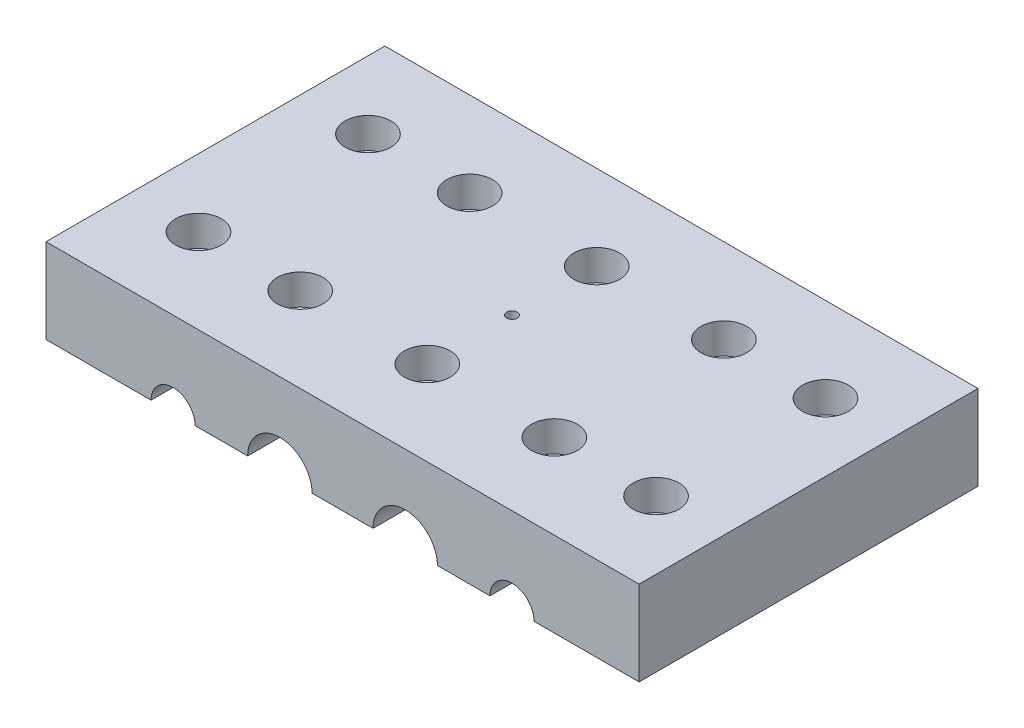
ISO-10303-21;
HEADER;
FILE_DESCRIPTION(('STEP AP214'),'2;1');
FILE_NAME('part.step','',(''),(''),'','','');
FILE_SCHEMA(('AUTOMOTIVE_DESIGN { 1 0 10303 214 1 1 1 1 }'));
ENDSEC;
DATA;
#1=APPLICATION_CONTEXT('core data for automotive mechanical design processes');
#2=APPLICATION_PROTOCOL_DEFINITION('international standard','automotive_design',2000,#1);
#3=PRODUCT_CONTEXT('',#1,'mechanical');
#4=PRODUCT('Part','Part','',(#3));
#5=PRODUCT_RELATED_PRODUCT_CATEGORY('part','',(#4));
#6=PRODUCT_DEFINITION_FORMATION('','',#4);
#7=PRODUCT_DEFINITION_CONTEXT('part definition',#1,'design');
#8=PRODUCT_DEFINITION('design','',#6,#7);
#9=PRODUCT_DEFINITION_SHAPE('','',#8);
#10=(LENGTH_UNIT() NAMED_UNIT(*) SI_UNIT(.MILLI.,.METRE.));
#11=(NAMED_UNIT(*) PLANE_ANGLE_UNIT() SI_UNIT($,.RADIAN.));
#12=(NAMED_UNIT(*) SI_UNIT($,.STERADIAN.) SOLID_ANGLE_UNIT());
#13=UNCERTAINTY_MEASURE_WITH_UNIT(LENGTH_MEASURE(1.E-05),#10,'distance_accuracy_value','');
#14=(GEOMETRIC_REPRESENTATION_CONTEXT(3) GLOBAL_UNCERTAINTY_ASSIGNED_CONTEXT((#13)) GLOBAL_UNIT_ASSIGNED_CONTEXT((#10,
#11,#12)) REPRESENTATION_CONTEXT('',''));
#15=CARTESIAN_POINT('',(0.,0.,0.));
#16=DIRECTION('',(0.,0.,1.));
#17=DIRECTION('',(1.,0.,0.));
#18=AXIS2_PLACEMENT_3D('',#15,#16,#17);
#19=CARTESIAN_POINT('',(0.,0.,0.));
#20=DIRECTION('',(0.,1.,0.));
#21=DIRECTION('',(0.,0.,1.));
#22=AXIS2_PLACEMENT_3D('',#19,#20,#21);
#23=PLANE('',#22);
#24=CARTESIAN_POINT('',(19.05,0.,12.7));
#25=DIRECTION('',(0.,1.,0.));
#26=DIRECTION('',(0.,0.,1.));
#27=AXIS2_PLACEMENT_3D('',#24,#25,#26);
#28=CIRCLE('',#27,2.286);
#29=CARTESIAN_POINT('',(19.05,0.,14.986));
#30=VERTEX_POINT('',#29);
#31=EDGE_CURVE('E334',#30,#30,#28,.T.);
#32=ORIENTED_EDGE('',*,*,#31,.T.);
#33=EDGE_LOOP('',(#32));
#34=FACE_BOUND('',#33,.T.);
#35=CARTESIAN_POINT('',(19.05,0.,-12.7));
#36=DIRECTION('',(0.,1.,0.));
#37=DIRECTION('',(0.,0.,1.));
#38=AXIS2_PLACEMENT_3D('',#35,#36,#37);
#39=CIRCLE('',#38,2.286);
#40=CARTESIAN_POINT('',(19.05,0.,-10.414));
#41=VERTEX_POINT('',#40);
#42=EDGE_CURVE('E241',#41,#41,#39,.T.);
#43=ORIENTED_EDGE('',*,*,#42,.T.);
#44=EDGE_LOOP('',(#43));
#45=FACE_BOUND('',#44,.T.);
#46=DIRECTION('',(-1.,0.,0.));
#47=VECTOR('',#46,1.);
#48=CARTESIAN_POINT('',(-44.45,0.,-25.4));
#49=LINE('',#48,#47);
#50=CARTESIAN_POINT('',(22.098,0.,-25.4));
#51=VERTEX_POINT('',#50);
#52=CARTESIAN_POINT('',(14.224,0.,-25.4));
#53=VERTEX_POINT('',#52);
#54=EDGE_CURVE('E57',#51,#53,#49,.T.);
#55=ORIENTED_EDGE('',*,*,#54,.F.);
#56=DIRECTION('',(0.,0.,1.));
#57=VECTOR('',#56,1.);
#58=CARTESIAN_POINT('',(22.098,0.,-25.4));
#59=LINE('',#58,#57);
#60=CARTESIAN_POINT('',(22.098,0.,25.4));
#61=VERTEX_POINT('',#60);
#62=EDGE_CURVE('E123',#51,#61,#59,.T.);
#63=ORIENTED_EDGE('',*,*,#62,.T.);
#64=DIRECTION('',(1.,0.,0.));
#65=VECTOR('',#64,1.);
#66=CARTESIAN_POINT('',(-44.45,0.,25.4));
#67=LINE('',#66,#65);
#68=CARTESIAN_POINT('',(14.224,0.,25.4));
#69=VERTEX_POINT('',#68);
#70=EDGE_CURVE('E463',#69,#61,#67,.T.);
#71=ORIENTED_EDGE('',*,*,#70,.F.);
#72=DIRECTION('',(0.,0.,1.));
#73=VECTOR('',#72,1.);
#74=CARTESIAN_POINT('',(14.224,0.,-25.4));
#75=LINE('',#74,#73);
#76=EDGE_CURVE('E137',#53,#69,#75,.T.);
#77=ORIENTED_EDGE('',*,*,#76,.F.);
#78=EDGE_LOOP('',(#55,#63,#71,#77));
#79=FACE_BOUND('',#78,.T.);
#80=ADVANCED_FACE('F35',(#34,#45,#79),#23,.F.);
#81=CARTESIAN_POINT('',(0.,0.,12.7));
#82=DIRECTION('',(0.,1.,0.));
#83=DIRECTION('',(0.,0.,1.));
#84=AXIS2_PLACEMENT_3D('',#81,#82,#83);
#85=CIRCLE('',#84,2.286);
#86=CARTESIAN_POINT('',(0.,0.,14.986));
#87=VERTEX_POINT('',#86);
#88=EDGE_CURVE('E328',#87,#87,#85,.T.);
#89=ORIENTED_EDGE('',*,*,#88,.T.);
#90=EDGE_LOOP('',(#89));
#91=FACE_BOUND('',#90,.T.);
#92=CARTESIAN_POINT('',(0.,0.,0.));
#93=DIRECTION('',(0.,1.,0.));
#94=DIRECTION('',(0.,0.,1.));
#95=AXIS2_PLACEMENT_3D('',#92,#93,#94);
#96=CIRCLE('',#95,0.7874);
#97=CARTESIAN_POINT('',(0.,0.,0.7874));
#98=VERTEX_POINT('',#97);
#99=EDGE_CURVE('E306',#98,#98,#96,.T.);
#100=ORIENTED_EDGE('',*,*,#99,.T.);
#101=EDGE_LOOP('',(#100));
#102=FACE_BOUND('',#101,.T.);
#103=CARTESIAN_POINT('',(0.,0.,-12.7));
#104=DIRECTION('',(0.,1.,0.));
#105=DIRECTION('',(0.,0.,1.));
#106=AXIS2_PLACEMENT_3D('',#103,#104,#105);
#107=CIRCLE('',#106,2.286);
#108=CARTESIAN_POINT('',(0.,0.,-10.414));
#109=VERTEX_POINT('',#108);
#110=EDGE_CURVE('E235',#109,#109,#107,.T.);
#111=ORIENTED_EDGE('',*,*,#110,.T.);
#112=EDGE_LOOP('',(#111));
#113=FACE_BOUND('',#112,.T.);
#114=CARTESIAN_POINT('',(4.57200000000001,0.,-25.4));
#115=VERTEX_POINT('',#114);
#116=CARTESIAN_POINT('',(-4.57199999999999,0.,-25.4));
#117=VERTEX_POINT('',#116);
#118=EDGE_CURVE('E138',#115,#117,#49,.T.);
#119=ORIENTED_EDGE('',*,*,#118,.F.);
#120=DIRECTION('',(0.,0.,1.));
#121=VECTOR('',#120,1.);
#122=CARTESIAN_POINT('',(4.57200000000001,0.,-25.4));
#123=LINE('',#122,#121);
#124=CARTESIAN_POINT('',(4.57200000000001,0.,25.4));
#125=VERTEX_POINT('',#124);
#126=EDGE_CURVE('E297',#115,#125,#123,.T.);
#127=ORIENTED_EDGE('',*,*,#126,.T.);
#128=CARTESIAN_POINT('',(-4.57199999999999,0.,25.4));
#129=VERTEX_POINT('',#128);
#130=EDGE_CURVE('E461',#129,#125,#67,.T.);
#131=ORIENTED_EDGE('',*,*,#130,.F.);
#132=DIRECTION('',(0.,0.,1.));
#133=VECTOR('',#132,1.);
#134=CARTESIAN_POINT('',(-4.57199999999999,0.,-25.4));
#135=LINE('',#134,#133);
#136=EDGE_CURVE('E285',#117,#129,#135,.T.);
#137=ORIENTED_EDGE('',*,*,#136,.F.);
#138=EDGE_LOOP('',(#119,#127,#131,#137));
#139=FACE_BOUND('',#138,.T.);
#140=ADVANCED_FACE('F359',(#91,#102,#113,#139),#23,.F.);
#141=CARTESIAN_POINT('',(-19.05,0.,12.7));
#142=DIRECTION('',(0.,1.,0.));
#143=DIRECTION('',(0.,0.,1.));
#144=AXIS2_PLACEMENT_3D('',#141,#142,#143);
#145=CIRCLE('',#144,2.286);
#146=CARTESIAN_POINT('',(-19.05,0.,14.986));
#147=VERTEX_POINT('',#146);
#148=EDGE_CURVE('E322',#147,#147,#145,.T.);
#149=ORIENTED_EDGE('',*,*,#148,.T.);
#150=EDGE_LOOP('',(#149));
#151=FACE_BOUND('',#150,.T.);
#152=CARTESIAN_POINT('',(-19.05,0.,-12.7));
#153=DIRECTION('',(0.,1.,0.));
#154=DIRECTION('',(0.,0.,1.));
#155=AXIS2_PLACEMENT_3D('',#152,#153,#154);
#156=CIRCLE('',#155,2.286);
#157=CARTESIAN_POINT('',(-19.05,0.,-10.414));
#158=VERTEX_POINT('',#157);
#159=EDGE_CURVE('E229',#158,#158,#156,.T.);
#160=ORIENTED_EDGE('',*,*,#159,.T.);
#161=EDGE_LOOP('',(#160));
#162=FACE_BOUND('',#161,.T.);
#163=CARTESIAN_POINT('',(-14.224,0.,-25.4));
#164=VERTEX_POINT('',#163);
#165=CARTESIAN_POINT('',(-22.098,0.,-25.4));
#166=VERTEX_POINT('',#165);
#167=EDGE_CURVE('E142',#164,#166,#49,.T.);
#168=ORIENTED_EDGE('',*,*,#167,.F.);
#169=DIRECTION('',(0.,0.,1.));
#170=VECTOR('',#169,1.);
#171=CARTESIAN_POINT('',(-14.224,0.,-25.4));
#172=LINE('',#171,#170);
#173=CARTESIAN_POINT('',(-14.224,0.,25.4));
#174=VERTEX_POINT('',#173);
#175=EDGE_CURVE('E288',#164,#174,#172,.T.);
#176=ORIENTED_EDGE('',*,*,#175,.T.);
#177=CARTESIAN_POINT('',(-22.098,0.,25.4));
#178=VERTEX_POINT('',#177);
#179=EDGE_CURVE('E153',#178,#174,#67,.T.);
#180=ORIENTED_EDGE('',*,*,#179,.F.);
#181=DIRECTION('',(0.,0.,1.));
#182=VECTOR('',#181,1.);
#183=CARTESIAN_POINT('',(-22.098,0.,-25.4));
#184=LINE('',#183,#182);
#185=EDGE_CURVE('E278',#166,#178,#184,.T.);
#186=ORIENTED_EDGE('',*,*,#185,.F.);
#187=EDGE_LOOP('',(#168,#176,#180,#186));
#188=FACE_BOUND('',#187,.T.);
#189=ADVANCED_FACE('F365',(#151,#162,#188),#23,.F.);
#190=CARTESIAN_POINT('',(-34.29,0.,12.7));
#191=DIRECTION('',(0.,1.,0.));
#192=DIRECTION('',(0.,0.,1.));
#193=AXIS2_PLACEMENT_3D('',#190,#191,#192);
#194=CIRCLE('',#193,2.286);
#195=CARTESIAN_POINT('',(-34.29,0.,14.986));
#196=VERTEX_POINT('',#195);
#197=EDGE_CURVE('E316',#196,#196,#194,.T.);
#198=ORIENTED_EDGE('',*,*,#197,.T.);
#199=EDGE_LOOP('',(#198));
#200=FACE_BOUND('',#199,.T.);
#201=CARTESIAN_POINT('',(-34.29,0.,-12.7));
#202=DIRECTION('',(0.,1.,0.));
#203=DIRECTION('',(0.,0.,1.));
#204=AXIS2_PLACEMENT_3D('',#201,#202,#203);
#205=CIRCLE('',#204,2.286);
#206=CARTESIAN_POINT('',(-34.29,0.,-10.414));
#207=VERTEX_POINT('',#206);
#208=EDGE_CURVE('E223',#207,#207,#205,.T.);
#209=ORIENTED_EDGE('',*,*,#208,.T.);
#210=EDGE_LOOP('',(#209));
#211=FACE_BOUND('',#210,.T.);
#212=CARTESIAN_POINT('',(-28.702,0.,-25.4));
#213=VERTEX_POINT('',#212);
#214=CARTESIAN_POINT('',(-44.45,0.,-25.4));
#215=VERTEX_POINT('',#214);
#216=EDGE_CURVE('E141',#213,#215,#49,.T.);
#217=ORIENTED_EDGE('',*,*,#216,.F.);
#218=DIRECTION('',(0.,0.,1.));
#219=VECTOR('',#218,1.);
#220=CARTESIAN_POINT('',(-28.702,0.,-25.4));
#221=LINE('',#220,#219);
#222=CARTESIAN_POINT('',(-28.702,0.,25.4));
#223=VERTEX_POINT('',#222);
#224=EDGE_CURVE('E173',#213,#223,#221,.T.);
#225=ORIENTED_EDGE('',*,*,#224,.T.);
#226=CARTESIAN_POINT('',(-44.45,0.,25.4));
#227=VERTEX_POINT('',#226);
#228=EDGE_CURVE('E149',#227,#223,#67,.T.);
#229=ORIENTED_EDGE('',*,*,#228,.F.);
#230=DIRECTION('',(0.,0.,1.));
#231=VECTOR('',#230,1.);
#232=CARTESIAN_POINT('',(-44.45,0.,-25.4));
#233=LINE('',#232,#231);
#234=EDGE_CURVE('E140',#215,#227,#233,.T.);
#235=ORIENTED_EDGE('',*,*,#234,.F.);
#236=EDGE_LOOP('',(#217,#225,#229,#235));
#237=FACE_BOUND('',#236,.T.);
#238=ADVANCED_FACE('F171',(#200,#211,#237),#23,.F.);
#239=CARTESIAN_POINT('',(44.45,12.7,-25.4));
#240=DIRECTION('',(-1.,0.,0.));
#241=DIRECTION('',(0.,0.,1.));
#242=AXIS2_PLACEMENT_3D('',#239,#240,#241);
#243=PLANE('',#242);
#244=DIRECTION('',(0.,0.,-1.));
#245=VECTOR('',#244,1.);
#246=CARTESIAN_POINT('',(44.45,0.,-25.4));
#247=LINE('',#246,#245);
#248=CARTESIAN_POINT('',(44.45,0.,25.4));
#249=VERTEX_POINT('',#248);
#250=CARTESIAN_POINT('',(44.45,0.,-25.4));
#251=VERTEX_POINT('',#250);
#252=EDGE_CURVE('E145',#249,#251,#247,.T.);
#253=ORIENTED_EDGE('',*,*,#252,.T.);
#254=DIRECTION('',(0.,-1.,0.));
#255=VECTOR('',#254,1.);
#256=CARTESIAN_POINT('',(44.45,12.7,-25.4));
#257=LINE('',#256,#255);
#258=CARTESIAN_POINT('',(44.45,12.7,-25.4));
#259=VERTEX_POINT('',#258);
#260=EDGE_CURVE('E11',#259,#251,#257,.T.);
#261=ORIENTED_EDGE('',*,*,#260,.F.);
#262=DIRECTION('',(0.,0.,-1.));
#263=VECTOR('',#262,1.);
#264=CARTESIAN_POINT('',(44.45,12.7,-25.4));
#265=LINE('',#264,#263);
#266=CARTESIAN_POINT('',(44.45,12.7,25.4));
#267=VERTEX_POINT('',#266);
#268=EDGE_CURVE('E152',#267,#259,#265,.T.);
#269=ORIENTED_EDGE('',*,*,#268,.F.);
#270=DIRECTION('',(0.,-1.,0.));
#271=VECTOR('',#270,1.);
#272=CARTESIAN_POINT('',(44.45,12.7,25.4));
#273=LINE('',#272,#271);
#274=EDGE_CURVE('E154',#267,#249,#273,.T.);
#275=ORIENTED_EDGE('',*,*,#274,.T.);
#276=EDGE_LOOP('',(#253,#261,#269,#275));
#277=FACE_BOUND('',#276,.T.);
#278=ADVANCED_FACE('F37',(#277),#243,.F.);
#279=CARTESIAN_POINT('',(-44.45,12.7,-25.4));
#280=DIRECTION('',(0.,0.,1.));
#281=DIRECTION('',(1.,0.,0.));
#282=AXIS2_PLACEMENT_3D('',#279,#280,#281);
#283=PLANE('',#282);
#284=CARTESIAN_POINT('',(28.702,0.,-25.4));
#285=VERTEX_POINT('',#284);
#286=EDGE_CURVE('E134',#251,#285,#49,.T.);
#287=ORIENTED_EDGE('',*,*,#286,.T.);
#288=CARTESIAN_POINT('',(25.4,0.,-25.4));
#289=DIRECTION('',(0.,0.,1.));
#290=DIRECTION('',(1.,0.,0.));
#291=AXIS2_PLACEMENT_3D('',#288,#289,#290);
#292=CIRCLE('',#291,3.302);
#293=EDGE_CURVE('E50',#285,#51,#292,.T.);
#294=ORIENTED_EDGE('',*,*,#293,.T.);
#295=ORIENTED_EDGE('',*,*,#54,.T.);
#296=CARTESIAN_POINT('',(9.39800000000001,0.,-25.4));
#297=DIRECTION('',(0.,0.,1.));
#298=DIRECTION('',(1.,0.,0.));
#299=AXIS2_PLACEMENT_3D('',#296,#297,#298);
#300=CIRCLE('',#299,4.826);
#301=EDGE_CURVE('E300',#53,#115,#300,.T.);
#302=ORIENTED_EDGE('',*,*,#301,.T.);
#303=ORIENTED_EDGE('',*,*,#118,.T.);
#304=CARTESIAN_POINT('',(-9.39799999999999,0.,-25.4));
#305=DIRECTION('',(0.,0.,1.));
#306=DIRECTION('',(1.,0.,0.));
#307=AXIS2_PLACEMENT_3D('',#304,#305,#306);
#308=CIRCLE('',#307,4.826);
#309=EDGE_CURVE('E291',#117,#164,#308,.T.);
#310=ORIENTED_EDGE('',*,*,#309,.T.);
#311=ORIENTED_EDGE('',*,*,#167,.T.);
#312=CARTESIAN_POINT('',(-25.4,0.,-25.4));
#313=DIRECTION('',(0.,0.,1.));
#314=DIRECTION('',(1.,0.,0.));
#315=AXIS2_PLACEMENT_3D('',#312,#313,#314);
#316=CIRCLE('',#315,3.302);
#317=EDGE_CURVE('E282',#166,#213,#316,.T.);
#318=ORIENTED_EDGE('',*,*,#317,.T.);
#319=ORIENTED_EDGE('',*,*,#216,.T.);
#320=DIRECTION('',(0.,-1.,0.));
#321=VECTOR('',#320,1.);
#322=CARTESIAN_POINT('',(-44.45,12.7,-25.4));
#323=LINE('',#322,#321);
#324=CARTESIAN_POINT('',(-44.45,12.7,-25.4));
#325=VERTEX_POINT('',#324);
#326=EDGE_CURVE('E43',#325,#215,#323,.T.);
#327=ORIENTED_EDGE('',*,*,#326,.F.);
#328=DIRECTION('',(-1.,0.,0.));
#329=VECTOR('',#328,1.);
#330=CARTESIAN_POINT('',(-44.45,12.7,-25.4));
#331=LINE('',#330,#329);
#332=EDGE_CURVE('E185',#259,#325,#331,.T.);
#333=ORIENTED_EDGE('',*,*,#332,.F.);
#334=ORIENTED_EDGE('',*,*,#260,.T.);
#335=EDGE_LOOP('',(#287,#294,#295,#302,#303,#310,#311,#318,#319,#327,#333,#334));
#336=FACE_BOUND('',#335,.T.);
#337=ADVANCED_FACE('F133',(#336),#283,.F.);
#338=CARTESIAN_POINT('',(-44.45,12.7,-25.4));
#339=DIRECTION('',(1.,0.,0.));
#340=DIRECTION('',(0.,0.,-1.));
#341=AXIS2_PLACEMENT_3D('',#338,#339,#340);
#342=PLANE('',#341);
#343=ORIENTED_EDGE('',*,*,#234,.T.);
#344=DIRECTION('',(0.,-1.,0.));
#345=VECTOR('',#344,1.);
#346=CARTESIAN_POINT('',(-44.45,12.7,25.4));
#347=LINE('',#346,#345);
#348=CARTESIAN_POINT('',(-44.45,12.7,25.4));
#349=VERTEX_POINT('',#348);
#350=EDGE_CURVE('E157',#349,#227,#347,.T.);
#351=ORIENTED_EDGE('',*,*,#350,.F.);
#352=DIRECTION('',(0.,0.,1.));
#353=VECTOR('',#352,1.);
#354=CARTESIAN_POINT('',(-44.45,12.7,-25.4));
#355=LINE('',#354,#353);
#356=EDGE_CURVE('E167',#325,#349,#355,.T.);
#357=ORIENTED_EDGE('',*,*,#356,.F.);
#358=ORIENTED_EDGE('',*,*,#326,.T.);
#359=EDGE_LOOP('',(#343,#351,#357,#358));
#360=FACE_BOUND('',#359,.T.);
#361=ADVANCED_FACE('F165',(#360),#342,.F.);
#362=CARTESIAN_POINT('',(-44.45,12.7,25.4));
#363=DIRECTION('',(0.,0.,-1.));
#364=DIRECTION('',(-1.,0.,0.));
#365=AXIS2_PLACEMENT_3D('',#362,#363,#364);
#366=PLANE('',#365);
#367=ORIENTED_EDGE('',*,*,#70,.T.);
#368=CARTESIAN_POINT('',(25.4,0.,25.4));
#369=DIRECTION('',(0.,0.,1.));
#370=DIRECTION('',(1.,0.,0.));
#371=AXIS2_PLACEMENT_3D('',#368,#369,#370);
#372=CIRCLE('',#371,3.302);
#373=CARTESIAN_POINT('',(28.702,0.,25.4));
#374=VERTEX_POINT('',#373);
#375=EDGE_CURVE('E126',#374,#61,#372,.T.);
#376=ORIENTED_EDGE('',*,*,#375,.F.);
#377=EDGE_CURVE('E148',#374,#249,#67,.T.);
#378=ORIENTED_EDGE('',*,*,#377,.T.);
#379=ORIENTED_EDGE('',*,*,#274,.F.);
#380=DIRECTION('',(1.,0.,0.));
#381=VECTOR('',#380,1.);
#382=CARTESIAN_POINT('',(-44.45,12.7,25.4));
#383=LINE('',#382,#381);
#384=EDGE_CURVE('E158',#349,#267,#383,.T.);
#385=ORIENTED_EDGE('',*,*,#384,.F.);
#386=ORIENTED_EDGE('',*,*,#350,.T.);
#387=ORIENTED_EDGE('',*,*,#228,.T.);
#388=CARTESIAN_POINT('',(-25.4,0.,25.4));
#389=DIRECTION('',(0.,0.,1.));
#390=DIRECTION('',(1.,0.,0.));
#391=AXIS2_PLACEMENT_3D('',#388,#389,#390);
#392=CIRCLE('',#391,3.302);
#393=EDGE_CURVE('E178',#178,#223,#392,.T.);
#394=ORIENTED_EDGE('',*,*,#393,.F.);
#395=ORIENTED_EDGE('',*,*,#179,.T.);
#396=CARTESIAN_POINT('',(-9.39799999999999,0.,25.4));
#397=DIRECTION('',(0.,0.,1.));
#398=DIRECTION('',(1.,0.,0.));
#399=AXIS2_PLACEMENT_3D('',#396,#397,#398);
#400=CIRCLE('',#399,4.826);
#401=EDGE_CURVE('E293',#129,#174,#400,.T.);
#402=ORIENTED_EDGE('',*,*,#401,.F.);
#403=ORIENTED_EDGE('',*,*,#130,.T.);
#404=CARTESIAN_POINT('',(9.39800000000001,0.,25.4));
#405=DIRECTION('',(0.,0.,1.));
#406=DIRECTION('',(1.,0.,0.));
#407=AXIS2_PLACEMENT_3D('',#404,#405,#406);
#408=CIRCLE('',#407,4.826);
#409=EDGE_CURVE('E302',#69,#125,#408,.T.);
#410=ORIENTED_EDGE('',*,*,#409,.F.);
#411=EDGE_LOOP('',(#367,#376,#378,#379,#385,#386,#387,#394,#395,#402,#403,#410));
#412=FACE_BOUND('',#411,.T.);
#413=ADVANCED_FACE('F176',(#412),#366,.F.);
#414=CARTESIAN_POINT('',(0.,12.7,0.));
#415=DIRECTION('',(0.,1.,0.));
#416=DIRECTION('',(0.,0.,1.));
#417=AXIS2_PLACEMENT_3D('',#414,#415,#416);
#418=PLANE('',#417);
#419=CARTESIAN_POINT('',(0.,12.7,0.));
#420=DIRECTION('',(0.,1.,0.));
#421=DIRECTION('',(0.,0.,1.));
#422=AXIS2_PLACEMENT_3D('',#419,#420,#421);
#423=CIRCLE('',#422,0.7874);
#424=CARTESIAN_POINT('',(0.,12.7,0.7874));
#425=VERTEX_POINT('',#424);
#426=EDGE_CURVE('E308',#425,#425,#423,.T.);
#427=ORIENTED_EDGE('',*,*,#426,.F.);
#428=EDGE_LOOP('',(#427));
#429=FACE_BOUND('',#428,.T.);
#430=CARTESIAN_POINT('',(34.29,12.7,12.7));
#431=DIRECTION('',(0.,1.,0.));
#432=DIRECTION('',(0.,0.,1.));
#433=AXIS2_PLACEMENT_3D('',#430,#431,#432);
#434=CIRCLE('',#433,3.429);
#435=CARTESIAN_POINT('',(34.29,12.7,16.129));
#436=VERTEX_POINT('',#435);
#437=EDGE_CURVE('E275',#436,#436,#434,.T.);
#438=ORIENTED_EDGE('',*,*,#437,.F.);
#439=EDGE_LOOP('',(#438));
#440=FACE_BOUND('',#439,.T.);
#441=CARTESIAN_POINT('',(19.05,12.7,12.7));
#442=DIRECTION('',(0.,1.,0.));
#443=DIRECTION('',(0.,0.,1.));
#444=AXIS2_PLACEMENT_3D('',#441,#442,#443);
#445=CIRCLE('',#444,3.429);
#446=CARTESIAN_POINT('',(19.05,12.7,16.129));
#447=VERTEX_POINT('',#446);
#448=EDGE_CURVE('E269',#447,#447,#445,.T.);
#449=ORIENTED_EDGE('',*,*,#448,.F.);
#450=EDGE_LOOP('',(#449));
#451=FACE_BOUND('',#450,.T.);
#452=CARTESIAN_POINT('',(0.,12.7,12.7));
#453=DIRECTION('',(0.,1.,0.));
#454=DIRECTION('',(0.,0.,1.));
#455=AXIS2_PLACEMENT_3D('',#452,#453,#454);
#456=CIRCLE('',#455,3.429);
#457=CARTESIAN_POINT('',(0.,12.7,16.129));
#458=VERTEX_POINT('',#457);
#459=EDGE_CURVE('E263',#458,#458,#456,.T.);
#460=ORIENTED_EDGE('',*,*,#459,.F.);
#461=EDGE_LOOP('',(#460));
#462=FACE_BOUND('',#461,.T.);
#463=CARTESIAN_POINT('',(-19.05,12.7,12.7));
#464=DIRECTION('',(0.,1.,0.));
#465=DIRECTION('',(0.,0.,1.));
#466=AXIS2_PLACEMENT_3D('',#463,#464,#465);
#467=CIRCLE('',#466,3.429);
#468=CARTESIAN_POINT('',(-19.05,12.7,16.129));
#469=VERTEX_POINT('',#468);
#470=EDGE_CURVE('E257',#469,#469,#467,.T.);
#471=ORIENTED_EDGE('',*,*,#470,.F.);
#472=EDGE_LOOP('',(#471));
#473=FACE_BOUND('',#472,.T.);
#474=CARTESIAN_POINT('',(-34.29,12.7,12.7));
#475=DIRECTION('',(0.,1.,0.));
#476=DIRECTION('',(0.,0.,1.));
#477=AXIS2_PLACEMENT_3D('',#474,#475,#476);
#478=CIRCLE('',#477,3.429);
#479=CARTESIAN_POINT('',(-34.29,12.7,16.129));
#480=VERTEX_POINT('',#479);
#481=EDGE_CURVE('E251',#480,#480,#478,.T.);
#482=ORIENTED_EDGE('',*,*,#481,.F.);
#483=EDGE_LOOP('',(#482));
#484=FACE_BOUND('',#483,.T.);
#485=CARTESIAN_POINT('',(34.29,12.7,-12.7));
#486=DIRECTION('',(0.,1.,0.));
#487=DIRECTION('',(0.,0.,1.));
#488=AXIS2_PLACEMENT_3D('',#485,#486,#487);
#489=CIRCLE('',#488,3.429);
#490=CARTESIAN_POINT('',(34.29,12.7,-9.271));
#491=VERTEX_POINT('',#490);
#492=EDGE_CURVE('E215',#491,#491,#489,.T.);
#493=ORIENTED_EDGE('',*,*,#492,.F.);
#494=EDGE_LOOP('',(#493));
#495=FACE_BOUND('',#494,.T.);
#496=CARTESIAN_POINT('',(19.05,12.7,-12.7));
#497=DIRECTION('',(0.,1.,0.));
#498=DIRECTION('',(0.,0.,1.));
#499=AXIS2_PLACEMENT_3D('',#496,#497,#498);
#500=CIRCLE('',#499,3.429);
#501=CARTESIAN_POINT('',(19.05,12.7,-9.271));
#502=VERTEX_POINT('',#501);
#503=EDGE_CURVE('E209',#502,#502,#500,.T.);
#504=ORIENTED_EDGE('',*,*,#503,.F.);
#505=EDGE_LOOP('',(#504));
#506=FACE_BOUND('',#505,.T.);
#507=CARTESIAN_POINT('',(0.,12.7,-12.7));
#508=DIRECTION('',(0.,1.,0.));
#509=DIRECTION('',(0.,0.,1.));
#510=AXIS2_PLACEMENT_3D('',#507,#508,#509);
#511=CIRCLE('',#510,3.429);
#512=CARTESIAN_POINT('',(0.,12.7,-9.271));
#513=VERTEX_POINT('',#512);
#514=EDGE_CURVE('E203',#513,#513,#511,.T.);
#515=ORIENTED_EDGE('',*,*,#514,.F.);
#516=EDGE_LOOP('',(#515));
#517=FACE_BOUND('',#516,.T.);
#518=CARTESIAN_POINT('',(-19.05,12.7,-12.7));
#519=DIRECTION('',(0.,1.,0.));
#520=DIRECTION('',(0.,0.,1.));
#521=AXIS2_PLACEMENT_3D('',#518,#519,#520);
#522=CIRCLE('',#521,3.429);
#523=CARTESIAN_POINT('',(-19.05,12.7,-9.271));
#524=VERTEX_POINT('',#523);
#525=EDGE_CURVE('E197',#524,#524,#522,.T.);
#526=ORIENTED_EDGE('',*,*,#525,.F.);
#527=EDGE_LOOP('',(#526));
#528=FACE_BOUND('',#527,.T.);
#529=CARTESIAN_POINT('',(-34.29,12.7,-12.7));
#530=DIRECTION('',(0.,1.,0.));
#531=DIRECTION('',(0.,0.,1.));
#532=AXIS2_PLACEMENT_3D('',#529,#530,#531);
#533=CIRCLE('',#532,3.429);
#534=CARTESIAN_POINT('',(-34.29,12.7,-9.271));
#535=VERTEX_POINT('',#534);
#536=EDGE_CURVE('E190',#535,#535,#533,.T.);
#537=ORIENTED_EDGE('',*,*,#536,.F.);
#538=EDGE_LOOP('',(#537));
#539=FACE_BOUND('',#538,.T.);
#540=ORIENTED_EDGE('',*,*,#268,.T.);
#541=ORIENTED_EDGE('',*,*,#332,.T.);
#542=ORIENTED_EDGE('',*,*,#356,.T.);
#543=ORIENTED_EDGE('',*,*,#384,.T.);
#544=EDGE_LOOP('',(#540,#541,#542,#543));
#545=FACE_BOUND('',#544,.T.);
#546=ADVANCED_FACE('F372',(#429,#440,#451,#462,#473,#484,#495,#506,#517,#528,#539,#545),#418,.T.);
#547=CARTESIAN_POINT('',(34.29,0.,12.7));
#548=DIRECTION('',(0.,1.,0.));
#549=DIRECTION('',(0.,0.,1.));
#550=AXIS2_PLACEMENT_3D('',#547,#548,#549);
#551=CIRCLE('',#550,2.286);
#552=CARTESIAN_POINT('',(34.29,0.,14.986));
#553=VERTEX_POINT('',#552);
#554=EDGE_CURVE('E340',#553,#553,#551,.T.);
#555=ORIENTED_EDGE('',*,*,#554,.T.);
#556=EDGE_LOOP('',(#555));
#557=FACE_BOUND('',#556,.T.);
#558=CARTESIAN_POINT('',(34.29,0.,-12.7));
#559=DIRECTION('',(0.,1.,0.));
#560=DIRECTION('',(0.,0.,1.));
#561=AXIS2_PLACEMENT_3D('',#558,#559,#560);
#562=CIRCLE('',#561,2.286);
#563=CARTESIAN_POINT('',(34.29,0.,-10.414));
#564=VERTEX_POINT('',#563);
#565=EDGE_CURVE('E247',#564,#564,#562,.T.);
#566=ORIENTED_EDGE('',*,*,#565,.T.);
#567=EDGE_LOOP('',(#566));
#568=FACE_BOUND('',#567,.T.);
#569=ORIENTED_EDGE('',*,*,#377,.F.);
#570=DIRECTION('',(0.,0.,1.));
#571=VECTOR('',#570,1.);
#572=CARTESIAN_POINT('',(28.702,0.,-25.4));
#573=LINE('',#572,#571);
#574=EDGE_CURVE('E130',#285,#374,#573,.T.);
#575=ORIENTED_EDGE('',*,*,#574,.F.);
#576=ORIENTED_EDGE('',*,*,#286,.F.);
#577=ORIENTED_EDGE('',*,*,#252,.F.);
#578=EDGE_LOOP('',(#569,#575,#576,#577));
#579=FACE_BOUND('',#578,.T.);
#580=ADVANCED_FACE('F344',(#557,#568,#579),#23,.F.);
#581=CARTESIAN_POINT('',(-34.29,8.128,-12.7));
#582=DIRECTION('',(0.,1.,0.));
#583=DIRECTION('',(0.,0.,1.));
#584=AXIS2_PLACEMENT_3D('',#581,#582,#583);
#585=CYLINDRICAL_SURFACE('',#584,3.429);
#586=CARTESIAN_POINT('',(-34.29,8.128,-12.7));
#587=DIRECTION('',(0.,1.,0.));
#588=DIRECTION('',(0.,0.,1.));
#589=AXIS2_PLACEMENT_3D('',#586,#587,#588);
#590=CIRCLE('',#589,3.429);
#591=CARTESIAN_POINT('',(-34.29,8.128,-9.271));
#592=VERTEX_POINT('',#591);
#593=EDGE_CURVE('E193',#592,#592,#590,.T.);
#594=ORIENTED_EDGE('',*,*,#593,.F.);
#595=EDGE_LOOP('',(#594));
#596=FACE_BOUND('',#595,.T.);
#597=ORIENTED_EDGE('',*,*,#536,.T.);
#598=EDGE_LOOP('',(#597));
#599=FACE_BOUND('',#598,.T.);
#600=ADVANCED_FACE('F371',(#596,#599),#585,.F.);
#601=CARTESIAN_POINT('',(-34.29,8.128,-12.7));
#602=DIRECTION('',(0.,1.,0.));
#603=DIRECTION('',(0.,0.,1.));
#604=AXIS2_PLACEMENT_3D('',#601,#602,#603);
#605=PLANE('',#604);
#606=CARTESIAN_POINT('',(-34.29,8.128,-12.7));
#607=DIRECTION('',(0.,1.,0.));
#608=DIRECTION('',(0.,0.,1.));
#609=AXIS2_PLACEMENT_3D('',#606,#607,#608);
#610=CIRCLE('',#609,2.286);
#611=CARTESIAN_POINT('',(-34.29,8.128,-10.414));
#612=VERTEX_POINT('',#611);
#613=EDGE_CURVE('E218',#612,#612,#610,.T.);
#614=ORIENTED_EDGE('',*,*,#613,.F.);
#615=EDGE_LOOP('',(#614));
#616=FACE_BOUND('',#615,.T.);
#617=ORIENTED_EDGE('',*,*,#593,.T.);
#618=EDGE_LOOP('',(#617));
#619=FACE_BOUND('',#618,.T.);
#620=ADVANCED_FACE('F377',(#616,#619),#605,.T.);
#621=CARTESIAN_POINT('',(-19.05,8.128,-12.7));
#622=DIRECTION('',(0.,1.,0.));
#623=DIRECTION('',(0.,0.,1.));
#624=AXIS2_PLACEMENT_3D('',#621,#622,#623);
#625=CYLINDRICAL_SURFACE('',#624,3.429);
#626=CARTESIAN_POINT('',(-19.05,8.128,-12.7));
#627=DIRECTION('',(0.,1.,0.));
#628=DIRECTION('',(0.,0.,1.));
#629=AXIS2_PLACEMENT_3D('',#626,#627,#628);
#630=CIRCLE('',#629,3.429);
#631=CARTESIAN_POINT('',(-19.05,8.128,-9.271));
#632=VERTEX_POINT('',#631);
#633=EDGE_CURVE('E194',#632,#632,#630,.T.);
#634=ORIENTED_EDGE('',*,*,#633,.F.);
#635=EDGE_LOOP('',(#634));
#636=FACE_BOUND('',#635,.T.);
#637=ORIENTED_EDGE('',*,*,#525,.T.);
#638=EDGE_LOOP('',(#637));
#639=FACE_BOUND('',#638,.T.);
#640=ADVANCED_FACE('F433',(#636,#639),#625,.F.);
#641=CARTESIAN_POINT('',(-19.05,8.128,-12.7));
#642=DIRECTION('',(0.,1.,0.));
#643=DIRECTION('',(0.,0.,1.));
#644=AXIS2_PLACEMENT_3D('',#641,#642,#643);
#645=PLANE('',#644);
#646=CARTESIAN_POINT('',(-19.05,8.128,-12.7));
#647=DIRECTION('',(0.,1.,0.));
#648=DIRECTION('',(0.,0.,1.));
#649=AXIS2_PLACEMENT_3D('',#646,#647,#648);
#650=CIRCLE('',#649,2.286);
#651=CARTESIAN_POINT('',(-19.05,8.128,-10.414));
#652=VERTEX_POINT('',#651);
#653=EDGE_CURVE('E226',#652,#652,#650,.T.);
#654=ORIENTED_EDGE('',*,*,#653,.F.);
#655=EDGE_LOOP('',(#654));
#656=FACE_BOUND('',#655,.T.);
#657=ORIENTED_EDGE('',*,*,#633,.T.);
#658=EDGE_LOOP('',(#657));
#659=FACE_BOUND('',#658,.T.);
#660=ADVANCED_FACE('F429',(#656,#659),#645,.T.);
#661=CARTESIAN_POINT('',(0.,8.128,-12.7));
#662=DIRECTION('',(0.,1.,0.));
#663=DIRECTION('',(0.,0.,1.));
#664=AXIS2_PLACEMENT_3D('',#661,#662,#663);
#665=CYLINDRICAL_SURFACE('',#664,3.429);
#666=CARTESIAN_POINT('',(0.,8.128,-12.7));
#667=DIRECTION('',(0.,1.,0.));
#668=DIRECTION('',(0.,0.,1.));
#669=AXIS2_PLACEMENT_3D('',#666,#667,#668);
#670=CIRCLE('',#669,3.429);
#671=CARTESIAN_POINT('',(0.,8.128,-9.271));
#672=VERTEX_POINT('',#671);
#673=EDGE_CURVE('E200',#672,#672,#670,.T.);
#674=ORIENTED_EDGE('',*,*,#673,.F.);
#675=EDGE_LOOP('',(#674));
#676=FACE_BOUND('',#675,.T.);
#677=ORIENTED_EDGE('',*,*,#514,.T.);
#678=EDGE_LOOP('',(#677));
#679=FACE_BOUND('',#678,.T.);
#680=ADVANCED_FACE('F425',(#676,#679),#665,.F.);
#681=CARTESIAN_POINT('',(0.,8.128,-12.7));
#682=DIRECTION('',(0.,1.,0.));
#683=DIRECTION('',(0.,0.,1.));
#684=AXIS2_PLACEMENT_3D('',#681,#682,#683);
#685=PLANE('',#684);
#686=CARTESIAN_POINT('',(0.,8.128,-12.7));
#687=DIRECTION('',(0.,1.,0.));
#688=DIRECTION('',(0.,0.,1.));
#689=AXIS2_PLACEMENT_3D('',#686,#687,#688);
#690=CIRCLE('',#689,2.286);
#691=CARTESIAN_POINT('',(0.,8.128,-10.414));
#692=VERTEX_POINT('',#691);
#693=EDGE_CURVE('E232',#692,#692,#690,.T.);
#694=ORIENTED_EDGE('',*,*,#693,.F.);
#695=EDGE_LOOP('',(#694));
#696=FACE_BOUND('',#695,.T.);
#697=ORIENTED_EDGE('',*,*,#673,.T.);
#698=EDGE_LOOP('',(#697));
#699=FACE_BOUND('',#698,.T.);
#700=ADVANCED_FACE('F421',(#696,#699),#685,.T.);
#701=CARTESIAN_POINT('',(19.05,8.128,-12.7));
#702=DIRECTION('',(0.,1.,0.));
#703=DIRECTION('',(0.,0.,1.));
#704=AXIS2_PLACEMENT_3D('',#701,#702,#703);
#705=CYLINDRICAL_SURFACE('',#704,3.429);
#706=CARTESIAN_POINT('',(19.05,8.128,-12.7));
#707=DIRECTION('',(0.,1.,0.));
#708=DIRECTION('',(0.,0.,1.));
#709=AXIS2_PLACEMENT_3D('',#706,#707,#708);
#710=CIRCLE('',#709,3.429);
#711=CARTESIAN_POINT('',(19.05,8.128,-9.271));
#712=VERTEX_POINT('',#711);
#713=EDGE_CURVE('E206',#712,#712,#710,.T.);
#714=ORIENTED_EDGE('',*,*,#713,.F.);
#715=EDGE_LOOP('',(#714));
#716=FACE_BOUND('',#715,.T.);
#717=ORIENTED_EDGE('',*,*,#503,.T.);
#718=EDGE_LOOP('',(#717));
#719=FACE_BOUND('',#718,.T.);
#720=ADVANCED_FACE('F417',(#716,#719),#705,.F.);
#721=CARTESIAN_POINT('',(19.05,8.128,-12.7));
#722=DIRECTION('',(0.,1.,0.));
#723=DIRECTION('',(0.,0.,1.));
#724=AXIS2_PLACEMENT_3D('',#721,#722,#723);
#725=PLANE('',#724);
#726=CARTESIAN_POINT('',(19.05,8.128,-12.7));
#727=DIRECTION('',(0.,1.,0.));
#728=DIRECTION('',(0.,0.,1.));
#729=AXIS2_PLACEMENT_3D('',#726,#727,#728);
#730=CIRCLE('',#729,2.286);
#731=CARTESIAN_POINT('',(19.05,8.128,-10.414));
#732=VERTEX_POINT('',#731);
#733=EDGE_CURVE('E238',#732,#732,#730,.T.);
#734=ORIENTED_EDGE('',*,*,#733,.F.);
#735=EDGE_LOOP('',(#734));
#736=FACE_BOUND('',#735,.T.);
#737=ORIENTED_EDGE('',*,*,#713,.T.);
#738=EDGE_LOOP('',(#737));
#739=FACE_BOUND('',#738,.T.);
#740=ADVANCED_FACE('F413',(#736,#739),#725,.T.);
#741=CARTESIAN_POINT('',(34.29,8.128,-12.7));
#742=DIRECTION('',(0.,1.,0.));
#743=DIRECTION('',(0.,0.,1.));
#744=AXIS2_PLACEMENT_3D('',#741,#742,#743);
#745=CYLINDRICAL_SURFACE('',#744,3.429);
#746=CARTESIAN_POINT('',(34.29,8.128,-12.7));
#747=DIRECTION('',(0.,1.,0.));
#748=DIRECTION('',(0.,0.,1.));
#749=AXIS2_PLACEMENT_3D('',#746,#747,#748);
#750=CIRCLE('',#749,3.429);
#751=CARTESIAN_POINT('',(34.29,8.128,-9.271));
#752=VERTEX_POINT('',#751);
#753=EDGE_CURVE('E212',#752,#752,#750,.T.);
#754=ORIENTED_EDGE('',*,*,#753,.F.);
#755=EDGE_LOOP('',(#754));
#756=FACE_BOUND('',#755,.T.);
#757=ORIENTED_EDGE('',*,*,#492,.T.);
#758=EDGE_LOOP('',(#757));
#759=FACE_BOUND('',#758,.T.);
#760=ADVANCED_FACE('F406',(#756,#759),#745,.F.);
#761=CARTESIAN_POINT('',(34.29,8.128,-12.7));
#762=DIRECTION('',(0.,1.,0.));
#763=DIRECTION('',(0.,0.,1.));
#764=AXIS2_PLACEMENT_3D('',#761,#762,#763);
#765=PLANE('',#764);
#766=CARTESIAN_POINT('',(34.29,8.128,-12.7));
#767=DIRECTION('',(0.,1.,0.));
#768=DIRECTION('',(0.,0.,1.));
#769=AXIS2_PLACEMENT_3D('',#766,#767,#768);
#770=CIRCLE('',#769,2.286);
#771=CARTESIAN_POINT('',(34.29,8.128,-10.414));
#772=VERTEX_POINT('',#771);
#773=EDGE_CURVE('E244',#772,#772,#770,.T.);
#774=ORIENTED_EDGE('',*,*,#773,.F.);
#775=EDGE_LOOP('',(#774));
#776=FACE_BOUND('',#775,.T.);
#777=ORIENTED_EDGE('',*,*,#753,.T.);
#778=EDGE_LOOP('',(#777));
#779=FACE_BOUND('',#778,.T.);
#780=ADVANCED_FACE('F396',(#776,#779),#765,.T.);
#781=CARTESIAN_POINT('',(-34.29,0.,-12.7));
#782=DIRECTION('',(0.,1.,0.));
#783=DIRECTION('',(0.,0.,1.));
#784=AXIS2_PLACEMENT_3D('',#781,#782,#783);
#785=CYLINDRICAL_SURFACE('',#784,2.286);
#786=ORIENTED_EDGE('',*,*,#613,.T.);
#787=EDGE_LOOP('',(#786));
#788=FACE_BOUND('',#787,.T.);
#789=ORIENTED_EDGE('',*,*,#208,.F.);
#790=EDGE_LOOP('',(#789));
#791=FACE_BOUND('',#790,.T.);
#792=ADVANCED_FACE('F393',(#788,#791),#785,.F.);
#793=CARTESIAN_POINT('',(-19.05,0.,-12.7));
#794=DIRECTION('',(0.,1.,0.));
#795=DIRECTION('',(0.,0.,1.));
#796=AXIS2_PLACEMENT_3D('',#793,#794,#795);
#797=CYLINDRICAL_SURFACE('',#796,2.286);
#798=ORIENTED_EDGE('',*,*,#653,.T.);
#799=EDGE_LOOP('',(#798));
#800=FACE_BOUND('',#799,.T.);
#801=ORIENTED_EDGE('',*,*,#159,.F.);
#802=EDGE_LOOP('',(#801));
#803=FACE_BOUND('',#802,.T.);
#804=ADVANCED_FACE('F395',(#800,#803),#797,.F.);
#805=CARTESIAN_POINT('',(0.,0.,-12.7));
#806=DIRECTION('',(0.,1.,0.));
#807=DIRECTION('',(0.,0.,1.));
#808=AXIS2_PLACEMENT_3D('',#805,#806,#807);
#809=CYLINDRICAL_SURFACE('',#808,2.286);
#810=ORIENTED_EDGE('',*,*,#693,.T.);
#811=EDGE_LOOP('',(#810));
#812=FACE_BOUND('',#811,.T.);
#813=ORIENTED_EDGE('',*,*,#110,.F.);
#814=EDGE_LOOP('',(#813));
#815=FACE_BOUND('',#814,.T.);
#816=ADVANCED_FACE('F403',(#812,#815),#809,.F.);
#817=CARTESIAN_POINT('',(19.05,0.,-12.7));
#818=DIRECTION('',(0.,1.,0.));
#819=DIRECTION('',(0.,0.,1.));
#820=AXIS2_PLACEMENT_3D('',#817,#818,#819);
#821=CYLINDRICAL_SURFACE('',#820,2.286);
#822=ORIENTED_EDGE('',*,*,#733,.T.);
#823=EDGE_LOOP('',(#822));
#824=FACE_BOUND('',#823,.T.);
#825=ORIENTED_EDGE('',*,*,#42,.F.);
#826=EDGE_LOOP('',(#825));
#827=FACE_BOUND('',#826,.T.);
#828=ADVANCED_FACE('F526',(#824,#827),#821,.F.);
#829=CARTESIAN_POINT('',(34.29,0.,-12.7));
#830=DIRECTION('',(0.,1.,0.));
#831=DIRECTION('',(0.,0.,1.));
#832=AXIS2_PLACEMENT_3D('',#829,#830,#831);
#833=CYLINDRICAL_SURFACE('',#832,2.286);
#834=ORIENTED_EDGE('',*,*,#773,.T.);
#835=EDGE_LOOP('',(#834));
#836=FACE_BOUND('',#835,.T.);
#837=ORIENTED_EDGE('',*,*,#565,.F.);
#838=EDGE_LOOP('',(#837));
#839=FACE_BOUND('',#838,.T.);
#840=ADVANCED_FACE('F522',(#836,#839),#833,.F.);
#841=CARTESIAN_POINT('',(-34.29,8.128,12.7));
#842=DIRECTION('',(0.,1.,0.));
#843=DIRECTION('',(0.,0.,1.));
#844=AXIS2_PLACEMENT_3D('',#841,#842,#843);
#845=CYLINDRICAL_SURFACE('',#844,3.429);
#846=CARTESIAN_POINT('',(-34.29,8.128,12.7));
#847=DIRECTION('',(0.,1.,0.));
#848=DIRECTION('',(0.,0.,1.));
#849=AXIS2_PLACEMENT_3D('',#846,#847,#848);
#850=CIRCLE('',#849,3.429);
#851=CARTESIAN_POINT('',(-34.29,8.128,16.129));
#852=VERTEX_POINT('',#851);
#853=EDGE_CURVE('E250',#852,#852,#850,.T.);
#854=ORIENTED_EDGE('',*,*,#853,.F.);
#855=EDGE_LOOP('',(#854));
#856=FACE_BOUND('',#855,.T.);
#857=ORIENTED_EDGE('',*,*,#481,.T.);
#858=EDGE_LOOP('',(#857));
#859=FACE_BOUND('',#858,.T.);
#860=ADVANCED_FACE('F518',(#856,#859),#845,.F.);
#861=CARTESIAN_POINT('',(-34.29,8.128,12.7));
#862=DIRECTION('',(0.,1.,0.));
#863=DIRECTION('',(0.,0.,1.));
#864=AXIS2_PLACEMENT_3D('',#861,#862,#863);
#865=PLANE('',#864);
#866=CARTESIAN_POINT('',(-34.29,8.128,12.7));
#867=DIRECTION('',(0.,1.,0.));
#868=DIRECTION('',(0.,0.,1.));
#869=AXIS2_PLACEMENT_3D('',#866,#867,#868);
#870=CIRCLE('',#869,2.286);
#871=CARTESIAN_POINT('',(-34.29,8.128,14.986));
#872=VERTEX_POINT('',#871);
#873=EDGE_CURVE('E311',#872,#872,#870,.T.);
#874=ORIENTED_EDGE('',*,*,#873,.F.);
#875=EDGE_LOOP('',(#874));
#876=FACE_BOUND('',#875,.T.);
#877=ORIENTED_EDGE('',*,*,#853,.T.);
#878=EDGE_LOOP('',(#877));
#879=FACE_BOUND('',#878,.T.);
#880=ADVANCED_FACE('F514',(#876,#879),#865,.T.);
#881=CARTESIAN_POINT('',(-19.05,8.128,12.7));
#882=DIRECTION('',(0.,1.,0.));
#883=DIRECTION('',(0.,0.,1.));
#884=AXIS2_PLACEMENT_3D('',#881,#882,#883);
#885=CYLINDRICAL_SURFACE('',#884,3.429);
#886=CARTESIAN_POINT('',(-19.05,8.128,12.7));
#887=DIRECTION('',(0.,1.,0.));
#888=DIRECTION('',(0.,0.,1.));
#889=AXIS2_PLACEMENT_3D('',#886,#887,#888);
#890=CIRCLE('',#889,3.429);
#891=CARTESIAN_POINT('',(-19.05,8.128,16.129));
#892=VERTEX_POINT('',#891);
#893=EDGE_CURVE('E254',#892,#892,#890,.T.);
#894=ORIENTED_EDGE('',*,*,#893,.F.);
#895=EDGE_LOOP('',(#894));
#896=FACE_BOUND('',#895,.T.);
#897=ORIENTED_EDGE('',*,*,#470,.T.);
#898=EDGE_LOOP('',(#897));
#899=FACE_BOUND('',#898,.T.);
#900=ADVANCED_FACE('F510',(#896,#899),#885,.F.);
#901=CARTESIAN_POINT('',(-19.05,8.128,12.7));
#902=DIRECTION('',(0.,1.,0.));
#903=DIRECTION('',(0.,0.,1.));
#904=AXIS2_PLACEMENT_3D('',#901,#902,#903);
#905=PLANE('',#904);
#906=CARTESIAN_POINT('',(-19.05,8.128,12.7));
#907=DIRECTION('',(0.,1.,0.));
#908=DIRECTION('',(0.,0.,1.));
#909=AXIS2_PLACEMENT_3D('',#906,#907,#908);
#910=CIRCLE('',#909,2.286);
#911=CARTESIAN_POINT('',(-19.05,8.128,14.986));
#912=VERTEX_POINT('',#911);
#913=EDGE_CURVE('E319',#912,#912,#910,.T.);
#914=ORIENTED_EDGE('',*,*,#913,.F.);
#915=EDGE_LOOP('',(#914));
#916=FACE_BOUND('',#915,.T.);
#917=ORIENTED_EDGE('',*,*,#893,.T.);
#918=EDGE_LOOP('',(#917));
#919=FACE_BOUND('',#918,.T.);
#920=ADVANCED_FACE('F506',(#916,#919),#905,.T.);
#921=CARTESIAN_POINT('',(0.,8.128,12.7));
#922=DIRECTION('',(0.,1.,0.));
#923=DIRECTION('',(0.,0.,1.));
#924=AXIS2_PLACEMENT_3D('',#921,#922,#923);
#925=CYLINDRICAL_SURFACE('',#924,3.429);
#926=CARTESIAN_POINT('',(0.,8.128,12.7));
#927=DIRECTION('',(0.,1.,0.));
#928=DIRECTION('',(0.,0.,1.));
#929=AXIS2_PLACEMENT_3D('',#926,#927,#928);
#930=CIRCLE('',#929,3.429);
#931=CARTESIAN_POINT('',(0.,8.128,16.129));
#932=VERTEX_POINT('',#931);
#933=EDGE_CURVE('E260',#932,#932,#930,.T.);
#934=ORIENTED_EDGE('',*,*,#933,.F.);
#935=EDGE_LOOP('',(#934));
#936=FACE_BOUND('',#935,.T.);
#937=ORIENTED_EDGE('',*,*,#459,.T.);
#938=EDGE_LOOP('',(#937));
#939=FACE_BOUND('',#938,.T.);
#940=ADVANCED_FACE('F502',(#936,#939),#925,.F.);
#941=CARTESIAN_POINT('',(0.,8.128,12.7));
#942=DIRECTION('',(0.,1.,0.));
#943=DIRECTION('',(0.,0.,1.));
#944=AXIS2_PLACEMENT_3D('',#941,#942,#943);
#945=PLANE('',#944);
#946=CARTESIAN_POINT('',(0.,8.128,12.7));
#947=DIRECTION('',(0.,1.,0.));
#948=DIRECTION('',(0.,0.,1.));
#949=AXIS2_PLACEMENT_3D('',#946,#947,#948);
#950=CIRCLE('',#949,2.286);
#951=CARTESIAN_POINT('',(0.,8.128,14.986));
#952=VERTEX_POINT('',#951);
#953=EDGE_CURVE('E325',#952,#952,#950,.T.);
#954=ORIENTED_EDGE('',*,*,#953,.F.);
#955=EDGE_LOOP('',(#954));
#956=FACE_BOUND('',#955,.T.);
#957=ORIENTED_EDGE('',*,*,#933,.T.);
#958=EDGE_LOOP('',(#957));
#959=FACE_BOUND('',#958,.T.);
#960=ADVANCED_FACE('F498',(#956,#959),#945,.T.);
#961=CARTESIAN_POINT('',(19.05,8.128,12.7));
#962=DIRECTION('',(0.,1.,0.));
#963=DIRECTION('',(0.,0.,1.));
#964=AXIS2_PLACEMENT_3D('',#961,#962,#963);
#965=CYLINDRICAL_SURFACE('',#964,3.429);
#966=CARTESIAN_POINT('',(19.05,8.128,12.7));
#967=DIRECTION('',(0.,1.,0.));
#968=DIRECTION('',(0.,0.,1.));
#969=AXIS2_PLACEMENT_3D('',#966,#967,#968);
#970=CIRCLE('',#969,3.429);
#971=CARTESIAN_POINT('',(19.05,8.128,16.129));
#972=VERTEX_POINT('',#971);
#973=EDGE_CURVE('E266',#972,#972,#970,.T.);
#974=ORIENTED_EDGE('',*,*,#973,.F.);
#975=EDGE_LOOP('',(#974));
#976=FACE_BOUND('',#975,.T.);
#977=ORIENTED_EDGE('',*,*,#448,.T.);
#978=EDGE_LOOP('',(#977));
#979=FACE_BOUND('',#978,.T.);
#980=ADVANCED_FACE('F494',(#976,#979),#965,.F.);
#981=CARTESIAN_POINT('',(19.05,8.128,12.7));
#982=DIRECTION('',(0.,1.,0.));
#983=DIRECTION('',(0.,0.,1.));
#984=AXIS2_PLACEMENT_3D('',#981,#982,#983);
#985=PLANE('',#984);
#986=CARTESIAN_POINT('',(19.05,8.128,12.7));
#987=DIRECTION('',(0.,1.,0.));
#988=DIRECTION('',(0.,0.,1.));
#989=AXIS2_PLACEMENT_3D('',#986,#987,#988);
#990=CIRCLE('',#989,2.286);
#991=CARTESIAN_POINT('',(19.05,8.128,14.986));
#992=VERTEX_POINT('',#991);
#993=EDGE_CURVE('E331',#992,#992,#990,.T.);
#994=ORIENTED_EDGE('',*,*,#993,.F.);
#995=EDGE_LOOP('',(#994));
#996=FACE_BOUND('',#995,.T.);
#997=ORIENTED_EDGE('',*,*,#973,.T.);
#998=EDGE_LOOP('',(#997));
#999=FACE_BOUND('',#998,.T.);
#1000=ADVANCED_FACE('F490',(#996,#999),#985,.T.);
#1001=CARTESIAN_POINT('',(34.29,8.128,12.7));
#1002=DIRECTION('',(0.,1.,0.));
#1003=DIRECTION('',(0.,0.,1.));
#1004=AXIS2_PLACEMENT_3D('',#1001,#1002,#1003);
#1005=CYLINDRICAL_SURFACE('',#1004,3.429);
#1006=CARTESIAN_POINT('',(34.29,8.128,12.7));
#1007=DIRECTION('',(0.,1.,0.));
#1008=DIRECTION('',(0.,0.,1.));
#1009=AXIS2_PLACEMENT_3D('',#1006,#1007,#1008);
#1010=CIRCLE('',#1009,3.429);
#1011=CARTESIAN_POINT('',(34.29,8.128,16.129));
#1012=VERTEX_POINT('',#1011);
#1013=EDGE_CURVE('E272',#1012,#1012,#1010,.T.);
#1014=ORIENTED_EDGE('',*,*,#1013,.F.);
#1015=EDGE_LOOP('',(#1014));
#1016=FACE_BOUND('',#1015,.T.);
#1017=ORIENTED_EDGE('',*,*,#437,.T.);
#1018=EDGE_LOOP('',(#1017));
#1019=FACE_BOUND('',#1018,.T.);
#1020=ADVANCED_FACE('F486',(#1016,#1019),#1005,.F.);
#1021=CARTESIAN_POINT('',(34.29,8.128,12.7));
#1022=DIRECTION('',(0.,1.,0.));
#1023=DIRECTION('',(0.,0.,1.));
#1024=AXIS2_PLACEMENT_3D('',#1021,#1022,#1023);
#1025=PLANE('',#1024);
#1026=CARTESIAN_POINT('',(34.29,8.128,12.7));
#1027=DIRECTION('',(0.,1.,0.));
#1028=DIRECTION('',(0.,0.,1.));
#1029=AXIS2_PLACEMENT_3D('',#1026,#1027,#1028);
#1030=CIRCLE('',#1029,2.286);
#1031=CARTESIAN_POINT('',(34.29,8.128,14.986));
#1032=VERTEX_POINT('',#1031);
#1033=EDGE_CURVE('E337',#1032,#1032,#1030,.T.);
#1034=ORIENTED_EDGE('',*,*,#1033,.F.);
#1035=EDGE_LOOP('',(#1034));
#1036=FACE_BOUND('',#1035,.T.);
#1037=ORIENTED_EDGE('',*,*,#1013,.T.);
#1038=EDGE_LOOP('',(#1037));
#1039=FACE_BOUND('',#1038,.T.);
#1040=ADVANCED_FACE('F480',(#1036,#1039),#1025,.T.);
#1041=CARTESIAN_POINT('',(-25.4,0.,-25.4));
#1042=DIRECTION('',(0.,0.,1.));
#1043=DIRECTION('',(1.,0.,0.));
#1044=AXIS2_PLACEMENT_3D('',#1041,#1042,#1043);
#1045=CYLINDRICAL_SURFACE('',#1044,3.302);
#1046=ORIENTED_EDGE('',*,*,#393,.T.);
#1047=ORIENTED_EDGE('',*,*,#224,.F.);
#1048=ORIENTED_EDGE('',*,*,#317,.F.);
#1049=ORIENTED_EDGE('',*,*,#185,.T.);
#1050=EDGE_LOOP('',(#1046,#1047,#1048,#1049));
#1051=FACE_BOUND('',#1050,.T.);
#1052=ADVANCED_FACE('F459',(#1051),#1045,.F.);
#1053=CARTESIAN_POINT('',(-9.39799999999999,0.,-25.4));
#1054=DIRECTION('',(0.,0.,1.));
#1055=DIRECTION('',(1.,0.,0.));
#1056=AXIS2_PLACEMENT_3D('',#1053,#1054,#1055);
#1057=CYLINDRICAL_SURFACE('',#1056,4.826);
#1058=ORIENTED_EDGE('',*,*,#401,.T.);
#1059=ORIENTED_EDGE('',*,*,#175,.F.);
#1060=ORIENTED_EDGE('',*,*,#309,.F.);
#1061=ORIENTED_EDGE('',*,*,#136,.T.);
#1062=EDGE_LOOP('',(#1058,#1059,#1060,#1061));
#1063=FACE_BOUND('',#1062,.T.);
#1064=ADVANCED_FACE('F472',(#1063),#1057,.F.);
#1065=CARTESIAN_POINT('',(9.39800000000001,0.,-25.4));
#1066=DIRECTION('',(0.,0.,1.));
#1067=DIRECTION('',(1.,0.,0.));
#1068=AXIS2_PLACEMENT_3D('',#1065,#1066,#1067);
#1069=CYLINDRICAL_SURFACE('',#1068,4.826);
#1070=ORIENTED_EDGE('',*,*,#409,.T.);
#1071=ORIENTED_EDGE('',*,*,#126,.F.);
#1072=ORIENTED_EDGE('',*,*,#301,.F.);
#1073=ORIENTED_EDGE('',*,*,#76,.T.);
#1074=EDGE_LOOP('',(#1070,#1071,#1072,#1073));
#1075=FACE_BOUND('',#1074,.T.);
#1076=ADVANCED_FACE('F467',(#1075),#1069,.F.);
#1077=CARTESIAN_POINT('',(25.4,0.,-25.4));
#1078=DIRECTION('',(0.,0.,1.));
#1079=DIRECTION('',(1.,0.,0.));
#1080=AXIS2_PLACEMENT_3D('',#1077,#1078,#1079);
#1081=CYLINDRICAL_SURFACE('',#1080,3.302);
#1082=ORIENTED_EDGE('',*,*,#375,.T.);
#1083=ORIENTED_EDGE('',*,*,#62,.F.);
#1084=ORIENTED_EDGE('',*,*,#293,.F.);
#1085=ORIENTED_EDGE('',*,*,#574,.T.);
#1086=EDGE_LOOP('',(#1082,#1083,#1084,#1085));
#1087=FACE_BOUND('',#1086,.T.);
#1088=ADVANCED_FACE('F124',(#1087),#1081,.F.);
#1089=CARTESIAN_POINT('',(0.,0.,0.));
#1090=DIRECTION('',(0.,1.,0.));
#1091=DIRECTION('',(0.,0.,1.));
#1092=AXIS2_PLACEMENT_3D('',#1089,#1090,#1091);
#1093=CYLINDRICAL_SURFACE('',#1092,0.7874);
#1094=ORIENTED_EDGE('',*,*,#99,.F.);
#1095=EDGE_LOOP('',(#1094));
#1096=FACE_BOUND('',#1095,.T.);
#1097=ORIENTED_EDGE('',*,*,#426,.T.);
#1098=EDGE_LOOP('',(#1097));
#1099=FACE_BOUND('',#1098,.T.);
#1100=ADVANCED_FACE('F625',(#1096,#1099),#1093,.F.);
#1101=CARTESIAN_POINT('',(-34.29,0.,12.7));
#1102=DIRECTION('',(0.,1.,0.));
#1103=DIRECTION('',(0.,0.,1.));
#1104=AXIS2_PLACEMENT_3D('',#1101,#1102,#1103);
#1105=CYLINDRICAL_SURFACE('',#1104,2.286);
#1106=ORIENTED_EDGE('',*,*,#873,.T.);
#1107=EDGE_LOOP('',(#1106));
#1108=FACE_BOUND('',#1107,.T.);
#1109=ORIENTED_EDGE('',*,*,#197,.F.);
#1110=EDGE_LOOP('',(#1109));
#1111=FACE_BOUND('',#1110,.T.);
#1112=ADVANCED_FACE('F639',(#1108,#1111),#1105,.F.);
#1113=CARTESIAN_POINT('',(-19.05,0.,12.7));
#1114=DIRECTION('',(0.,1.,0.));
#1115=DIRECTION('',(0.,0.,1.));
#1116=AXIS2_PLACEMENT_3D('',#1113,#1114,#1115);
#1117=CYLINDRICAL_SURFACE('',#1116,2.286);
#1118=ORIENTED_EDGE('',*,*,#913,.T.);
#1119=EDGE_LOOP('',(#1118));
#1120=FACE_BOUND('',#1119,.T.);
#1121=ORIENTED_EDGE('',*,*,#148,.F.);
#1122=EDGE_LOOP('',(#1121));
#1123=FACE_BOUND('',#1122,.T.);
#1124=ADVANCED_FACE('F673',(#1120,#1123),#1117,.F.);
#1125=CARTESIAN_POINT('',(0.,0.,12.7));
#1126=DIRECTION('',(0.,1.,0.));
#1127=DIRECTION('',(0.,0.,1.));
#1128=AXIS2_PLACEMENT_3D('',#1125,#1126,#1127);
#1129=CYLINDRICAL_SURFACE('',#1128,2.286);
#1130=ORIENTED_EDGE('',*,*,#953,.T.);
#1131=EDGE_LOOP('',(#1130));
#1132=FACE_BOUND('',#1131,.T.);
#1133=ORIENTED_EDGE('',*,*,#88,.F.);
#1134=EDGE_LOOP('',(#1133));
#1135=FACE_BOUND('',#1134,.T.);
#1136=ADVANCED_FACE('F355',(#1132,#1135),#1129,.F.);
#1137=CARTESIAN_POINT('',(19.05,0.,12.7));
#1138=DIRECTION('',(0.,1.,0.));
#1139=DIRECTION('',(0.,0.,1.));
#1140=AXIS2_PLACEMENT_3D('',#1137,#1138,#1139);
#1141=CYLINDRICAL_SURFACE('',#1140,2.286);
#1142=ORIENTED_EDGE('',*,*,#993,.T.);
#1143=EDGE_LOOP('',(#1142));
#1144=FACE_BOUND('',#1143,.T.);
#1145=ORIENTED_EDGE('',*,*,#31,.F.);
#1146=EDGE_LOOP('',(#1145));
#1147=FACE_BOUND('',#1146,.T.);
#1148=ADVANCED_FACE('F349',(#1144,#1147),#1141,.F.);
#1149=CARTESIAN_POINT('',(34.29,0.,12.7));
#1150=DIRECTION('',(0.,1.,0.));
#1151=DIRECTION('',(0.,0.,1.));
#1152=AXIS2_PLACEMENT_3D('',#1149,#1150,#1151);
#1153=CYLINDRICAL_SURFACE('',#1152,2.286);
#1154=ORIENTED_EDGE('',*,*,#1033,.T.);
#1155=EDGE_LOOP('',(#1154));
#1156=FACE_BOUND('',#1155,.T.);
#1157=ORIENTED_EDGE('',*,*,#554,.F.);
#1158=EDGE_LOOP('',(#1157));
#1159=FACE_BOUND('',#1158,.T.);
#1160=ADVANCED_FACE('F347',(#1156,#1159),#1153,.F.);
#1161=CLOSED_SHELL('',(#80,#140,#189,#238,#278,#337,#361,#413,#546,#580,#600,#620,#640,#660,
#680,#700,#720,#740,#760,#780,#792,#804,#816,#828,#840,#860,#880,#900,#920,#940,#960,#980,#1000,
#1020,#1040,#1052,#1064,#1076,#1088,#1100,#1112,#1124,#1136,#1148,#1160));
#1162=MANIFOLD_SOLID_BREP('B2',#1161);
#1163=ADVANCED_BREP_SHAPE_REPRESENTATION('',(#18,#1162),#14);
#1164=SHAPE_DEFINITION_REPRESENTATION(#9,#1163);
ENDSEC;
END-ISO-10303-21;
